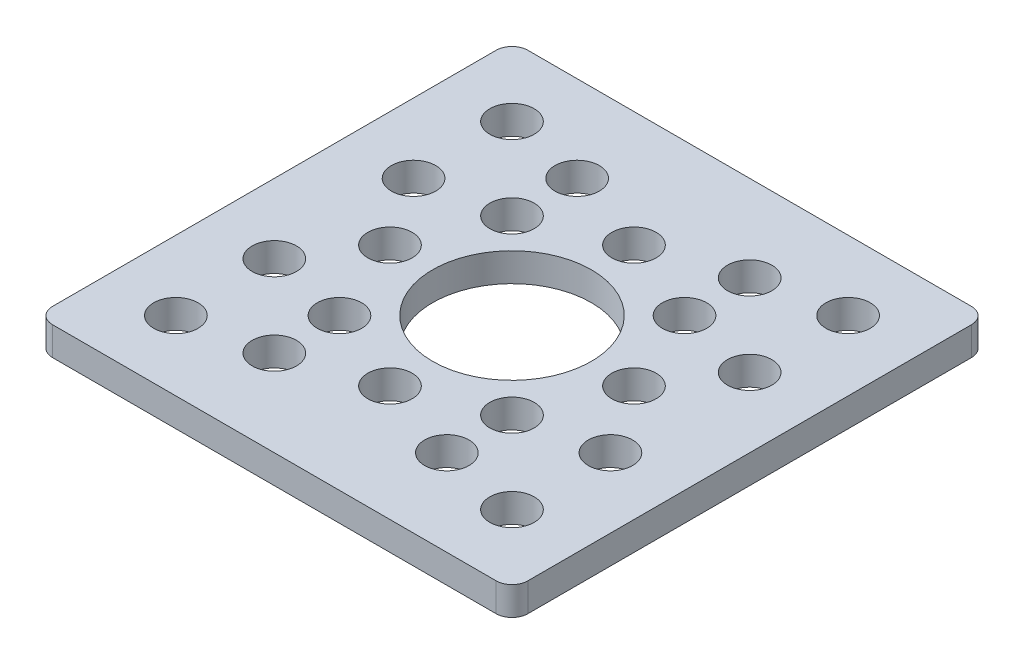
ISO-10303-21;
HEADER;
FILE_DESCRIPTION(('STEP AP214'),'2;1');
FILE_NAME('part.step','',(''),(''),'','','');
FILE_SCHEMA(('AUTOMOTIVE_DESIGN { 1 0 10303 214 1 1 1 1 }'));
ENDSEC;
DATA;
#1=APPLICATION_CONTEXT('core data for automotive mechanical design processes');
#2=APPLICATION_PROTOCOL_DEFINITION('international standard','automotive_design',2000,#1);
#3=PRODUCT_CONTEXT('',#1,'mechanical');
#4=PRODUCT('Part','Part','',(#3));
#5=PRODUCT_RELATED_PRODUCT_CATEGORY('part','',(#4));
#6=PRODUCT_DEFINITION_FORMATION('','',#4);
#7=PRODUCT_DEFINITION_CONTEXT('part definition',#1,'design');
#8=PRODUCT_DEFINITION('design','',#6,#7);
#9=PRODUCT_DEFINITION_SHAPE('','',#8);
#10=(LENGTH_UNIT() NAMED_UNIT(*) SI_UNIT(.MILLI.,.METRE.));
#11=(NAMED_UNIT(*) PLANE_ANGLE_UNIT() SI_UNIT($,.RADIAN.));
#12=(NAMED_UNIT(*) SI_UNIT($,.STERADIAN.) SOLID_ANGLE_UNIT());
#13=UNCERTAINTY_MEASURE_WITH_UNIT(LENGTH_MEASURE(1.E-05),#10,'distance_accuracy_value','');
#14=(GEOMETRIC_REPRESENTATION_CONTEXT(3) GLOBAL_UNCERTAINTY_ASSIGNED_CONTEXT((#13)) GLOBAL_UNIT_ASSIGNED_CONTEXT((#10,
#11,#12)) REPRESENTATION_CONTEXT('',''));
#15=CARTESIAN_POINT('',(0.,0.,0.));
#16=DIRECTION('',(0.,0.,1.));
#17=DIRECTION('',(1.,0.,0.));
#18=AXIS2_PLACEMENT_3D('',#15,#16,#17);
#19=CARTESIAN_POINT('',(-17.78,2.286,-17.78));
#20=DIRECTION('',(0.,-1.,0.));
#21=DIRECTION('',(0.,0.,-1.));
#22=AXIS2_PLACEMENT_3D('',#19,#20,#21);
#23=CYLINDRICAL_SURFACE('',#22,1.27);
#24=CARTESIAN_POINT('',(-17.78,0.,-17.78));
#25=DIRECTION('',(0.,-1.,0.));
#26=DIRECTION('',(0.,0.,-1.));
#27=AXIS2_PLACEMENT_3D('',#24,#25,#26);
#28=CIRCLE('',#27,1.27);
#29=CARTESIAN_POINT('',(-19.05,0.,-17.78));
#30=VERTEX_POINT('',#29);
#31=CARTESIAN_POINT('',(-17.78,0.,-19.05));
#32=VERTEX_POINT('',#31);
#33=EDGE_CURVE('E132',#30,#32,#28,.T.);
#34=ORIENTED_EDGE('',*,*,#33,.F.);
#35=DIRECTION('',(0.,-1.,0.));
#36=VECTOR('',#35,1.);
#37=CARTESIAN_POINT('',(-19.05,2.286,-17.78));
#38=LINE('',#37,#36);
#39=CARTESIAN_POINT('',(-19.05,2.286,-17.78));
#40=VERTEX_POINT('',#39);
#41=EDGE_CURVE('E11',#40,#30,#38,.T.);
#42=ORIENTED_EDGE('',*,*,#41,.F.);
#43=CARTESIAN_POINT('',(-17.78,2.286,-17.78));
#44=DIRECTION('',(0.,-1.,0.));
#45=DIRECTION('',(0.,0.,-1.));
#46=AXIS2_PLACEMENT_3D('',#43,#44,#45);
#47=CIRCLE('',#46,1.27);
#48=CARTESIAN_POINT('',(-17.78,2.286,-19.05));
#49=VERTEX_POINT('',#48);
#50=EDGE_CURVE('E153',#40,#49,#47,.T.);
#51=ORIENTED_EDGE('',*,*,#50,.T.);
#52=DIRECTION('',(0.,-1.,0.));
#53=VECTOR('',#52,1.);
#54=CARTESIAN_POINT('',(-17.78,2.286,-19.05));
#55=LINE('',#54,#53);
#56=EDGE_CURVE('E38',#49,#32,#55,.T.);
#57=ORIENTED_EDGE('',*,*,#56,.T.);
#58=EDGE_LOOP('',(#34,#42,#51,#57));
#59=FACE_BOUND('',#58,.T.);
#60=ADVANCED_FACE('F35',(#59),#23,.T.);
#61=CARTESIAN_POINT('',(-19.05,2.286,17.78));
#62=DIRECTION('',(-1.,0.,0.));
#63=DIRECTION('',(0.,0.,1.));
#64=AXIS2_PLACEMENT_3D('',#61,#62,#63);
#65=PLANE('',#64);
#66=DIRECTION('',(0.,0.,-1.));
#67=VECTOR('',#66,1.);
#68=CARTESIAN_POINT('',(-19.05,0.,17.78));
#69=LINE('',#68,#67);
#70=CARTESIAN_POINT('',(-19.05,0.,17.78));
#71=VERTEX_POINT('',#70);
#72=EDGE_CURVE('E151',#71,#30,#69,.T.);
#73=ORIENTED_EDGE('',*,*,#72,.F.);
#74=DIRECTION('',(0.,-1.,0.));
#75=VECTOR('',#74,1.);
#76=CARTESIAN_POINT('',(-19.05,2.286,17.78));
#77=LINE('',#76,#75);
#78=CARTESIAN_POINT('',(-19.05,2.286,17.78));
#79=VERTEX_POINT('',#78);
#80=EDGE_CURVE('E44',#79,#71,#77,.T.);
#81=ORIENTED_EDGE('',*,*,#80,.F.);
#82=DIRECTION('',(0.,0.,-1.));
#83=VECTOR('',#82,1.);
#84=CARTESIAN_POINT('',(-19.05,2.286,17.78));
#85=LINE('',#84,#83);
#86=EDGE_CURVE('E122',#79,#40,#85,.T.);
#87=ORIENTED_EDGE('',*,*,#86,.T.);
#88=ORIENTED_EDGE('',*,*,#41,.T.);
#89=EDGE_LOOP('',(#73,#81,#87,#88));
#90=FACE_BOUND('',#89,.T.);
#91=ADVANCED_FACE('F165',(#90),#65,.T.);
#92=CARTESIAN_POINT('',(-17.78,2.286,17.78));
#93=DIRECTION('',(0.,-1.,0.));
#94=DIRECTION('',(0.,0.,-1.));
#95=AXIS2_PLACEMENT_3D('',#92,#93,#94);
#96=CYLINDRICAL_SURFACE('',#95,1.27);
#97=CARTESIAN_POINT('',(-17.78,0.,17.78));
#98=DIRECTION('',(0.,-1.,0.));
#99=DIRECTION('',(0.,0.,-1.));
#100=AXIS2_PLACEMENT_3D('',#97,#98,#99);
#101=CIRCLE('',#100,1.27);
#102=CARTESIAN_POINT('',(-17.78,0.,19.05));
#103=VERTEX_POINT('',#102);
#104=EDGE_CURVE('E109',#103,#71,#101,.T.);
#105=ORIENTED_EDGE('',*,*,#104,.F.);
#106=DIRECTION('',(0.,-1.,0.));
#107=VECTOR('',#106,1.);
#108=CARTESIAN_POINT('',(-17.78,2.286,19.05));
#109=LINE('',#108,#107);
#110=CARTESIAN_POINT('',(-17.78,2.286,19.05));
#111=VERTEX_POINT('',#110);
#112=EDGE_CURVE('E104',#111,#103,#109,.T.);
#113=ORIENTED_EDGE('',*,*,#112,.F.);
#114=CARTESIAN_POINT('',(-17.78,2.286,17.78));
#115=DIRECTION('',(0.,-1.,0.));
#116=DIRECTION('',(0.,0.,-1.));
#117=AXIS2_PLACEMENT_3D('',#114,#115,#116);
#118=CIRCLE('',#117,1.27);
#119=EDGE_CURVE('E107',#111,#79,#118,.T.);
#120=ORIENTED_EDGE('',*,*,#119,.T.);
#121=ORIENTED_EDGE('',*,*,#80,.T.);
#122=EDGE_LOOP('',(#105,#113,#120,#121));
#123=FACE_BOUND('',#122,.T.);
#124=ADVANCED_FACE('F106',(#123),#96,.T.);
#125=CARTESIAN_POINT('',(17.78,2.286,19.05));
#126=DIRECTION('',(0.,0.,1.));
#127=DIRECTION('',(1.,0.,0.));
#128=AXIS2_PLACEMENT_3D('',#125,#126,#127);
#129=PLANE('',#128);
#130=DIRECTION('',(-1.,0.,0.));
#131=VECTOR('',#130,1.);
#132=CARTESIAN_POINT('',(17.78,0.,19.05));
#133=LINE('',#132,#131);
#134=CARTESIAN_POINT('',(17.78,0.,19.05));
#135=VERTEX_POINT('',#134);
#136=EDGE_CURVE('E148',#135,#103,#133,.T.);
#137=ORIENTED_EDGE('',*,*,#136,.F.);
#138=DIRECTION('',(0.,-1.,0.));
#139=VECTOR('',#138,1.);
#140=CARTESIAN_POINT('',(17.78,2.286,19.05));
#141=LINE('',#140,#139);
#142=CARTESIAN_POINT('',(17.78,2.286,19.05));
#143=VERTEX_POINT('',#142);
#144=EDGE_CURVE('E114',#143,#135,#141,.T.);
#145=ORIENTED_EDGE('',*,*,#144,.F.);
#146=DIRECTION('',(-1.,0.,0.));
#147=VECTOR('',#146,1.);
#148=CARTESIAN_POINT('',(17.78,2.286,19.05));
#149=LINE('',#148,#147);
#150=EDGE_CURVE('E120',#143,#111,#149,.T.);
#151=ORIENTED_EDGE('',*,*,#150,.T.);
#152=ORIENTED_EDGE('',*,*,#112,.T.);
#153=EDGE_LOOP('',(#137,#145,#151,#152));
#154=FACE_BOUND('',#153,.T.);
#155=ADVANCED_FACE('F124',(#154),#129,.T.);
#156=CARTESIAN_POINT('',(17.78,2.286,17.78));
#157=DIRECTION('',(0.,-1.,0.));
#158=DIRECTION('',(0.,0.,-1.));
#159=AXIS2_PLACEMENT_3D('',#156,#157,#158);
#160=CYLINDRICAL_SURFACE('',#159,1.27);
#161=CARTESIAN_POINT('',(17.78,0.,17.78));
#162=DIRECTION('',(0.,-1.,0.));
#163=DIRECTION('',(0.,0.,-1.));
#164=AXIS2_PLACEMENT_3D('',#161,#162,#163);
#165=CIRCLE('',#164,1.27);
#166=CARTESIAN_POINT('',(19.05,0.,17.78));
#167=VERTEX_POINT('',#166);
#168=EDGE_CURVE('E145',#167,#135,#165,.T.);
#169=ORIENTED_EDGE('',*,*,#168,.F.);
#170=DIRECTION('',(0.,-1.,0.));
#171=VECTOR('',#170,1.);
#172=CARTESIAN_POINT('',(19.05,2.286,17.78));
#173=LINE('',#172,#171);
#174=CARTESIAN_POINT('',(19.05,2.286,17.78));
#175=VERTEX_POINT('',#174);
#176=EDGE_CURVE('E157',#175,#167,#173,.T.);
#177=ORIENTED_EDGE('',*,*,#176,.F.);
#178=CARTESIAN_POINT('',(17.78,2.286,17.78));
#179=DIRECTION('',(0.,-1.,0.));
#180=DIRECTION('',(0.,0.,-1.));
#181=AXIS2_PLACEMENT_3D('',#178,#179,#180);
#182=CIRCLE('',#181,1.27);
#183=EDGE_CURVE('E125',#175,#143,#182,.T.);
#184=ORIENTED_EDGE('',*,*,#183,.T.);
#185=ORIENTED_EDGE('',*,*,#144,.T.);
#186=EDGE_LOOP('',(#169,#177,#184,#185));
#187=FACE_BOUND('',#186,.T.);
#188=ADVANCED_FACE('F178',(#187),#160,.T.);
#189=CARTESIAN_POINT('',(19.05,2.286,-17.78));
#190=DIRECTION('',(1.,0.,0.));
#191=DIRECTION('',(0.,0.,-1.));
#192=AXIS2_PLACEMENT_3D('',#189,#190,#191);
#193=PLANE('',#192);
#194=DIRECTION('',(0.,0.,1.));
#195=VECTOR('',#194,1.);
#196=CARTESIAN_POINT('',(19.05,0.,-17.78));
#197=LINE('',#196,#195);
#198=CARTESIAN_POINT('',(19.05,0.,-17.78));
#199=VERTEX_POINT('',#198);
#200=EDGE_CURVE('E142',#199,#167,#197,.T.);
#201=ORIENTED_EDGE('',*,*,#200,.F.);
#202=DIRECTION('',(0.,-1.,0.));
#203=VECTOR('',#202,1.);
#204=CARTESIAN_POINT('',(19.05,2.286,-17.78));
#205=LINE('',#204,#203);
#206=CARTESIAN_POINT('',(19.05,2.286,-17.78));
#207=VERTEX_POINT('',#206);
#208=EDGE_CURVE('E159',#207,#199,#205,.T.);
#209=ORIENTED_EDGE('',*,*,#208,.F.);
#210=DIRECTION('',(0.,0.,1.));
#211=VECTOR('',#210,1.);
#212=CARTESIAN_POINT('',(19.05,2.286,-17.78));
#213=LINE('',#212,#211);
#214=EDGE_CURVE('E127',#207,#175,#213,.T.);
#215=ORIENTED_EDGE('',*,*,#214,.T.);
#216=ORIENTED_EDGE('',*,*,#176,.T.);
#217=EDGE_LOOP('',(#201,#209,#215,#216));
#218=FACE_BOUND('',#217,.T.);
#219=ADVANCED_FACE('F181',(#218),#193,.T.);
#220=CARTESIAN_POINT('',(17.78,2.286,-17.78));
#221=DIRECTION('',(0.,-1.,0.));
#222=DIRECTION('',(0.,0.,-1.));
#223=AXIS2_PLACEMENT_3D('',#220,#221,#222);
#224=CYLINDRICAL_SURFACE('',#223,1.27);
#225=CARTESIAN_POINT('',(17.78,0.,-17.78));
#226=DIRECTION('',(0.,-1.,0.));
#227=DIRECTION('',(0.,0.,-1.));
#228=AXIS2_PLACEMENT_3D('',#225,#226,#227);
#229=CIRCLE('',#228,1.27);
#230=CARTESIAN_POINT('',(17.78,0.,-19.05));
#231=VERTEX_POINT('',#230);
#232=EDGE_CURVE('E139',#231,#199,#229,.T.);
#233=ORIENTED_EDGE('',*,*,#232,.F.);
#234=DIRECTION('',(0.,-1.,0.));
#235=VECTOR('',#234,1.);
#236=CARTESIAN_POINT('',(17.78,2.286,-19.05));
#237=LINE('',#236,#235);
#238=CARTESIAN_POINT('',(17.78,2.286,-19.05));
#239=VERTEX_POINT('',#238);
#240=EDGE_CURVE('E160',#239,#231,#237,.T.);
#241=ORIENTED_EDGE('',*,*,#240,.F.);
#242=CARTESIAN_POINT('',(17.78,2.286,-17.78));
#243=DIRECTION('',(0.,-1.,0.));
#244=DIRECTION('',(0.,0.,-1.));
#245=AXIS2_PLACEMENT_3D('',#242,#243,#244);
#246=CIRCLE('',#245,1.27);
#247=EDGE_CURVE('E417',#239,#207,#246,.T.);
#248=ORIENTED_EDGE('',*,*,#247,.T.);
#249=ORIENTED_EDGE('',*,*,#208,.T.);
#250=EDGE_LOOP('',(#233,#241,#248,#249));
#251=FACE_BOUND('',#250,.T.);
#252=ADVANCED_FACE('F185',(#251),#224,.T.);
#253=CARTESIAN_POINT('',(-17.78,2.286,-19.05));
#254=DIRECTION('',(0.,0.,-1.));
#255=DIRECTION('',(-1.,0.,0.));
#256=AXIS2_PLACEMENT_3D('',#253,#254,#255);
#257=PLANE('',#256);
#258=DIRECTION('',(1.,0.,0.));
#259=VECTOR('',#258,1.);
#260=CARTESIAN_POINT('',(-17.78,0.,-19.05));
#261=LINE('',#260,#259);
#262=EDGE_CURVE('E135',#32,#231,#261,.T.);
#263=ORIENTED_EDGE('',*,*,#262,.F.);
#264=ORIENTED_EDGE('',*,*,#56,.F.);
#265=DIRECTION('',(1.,0.,0.));
#266=VECTOR('',#265,1.);
#267=CARTESIAN_POINT('',(-17.78,2.286,-19.05));
#268=LINE('',#267,#266);
#269=EDGE_CURVE('E415',#49,#239,#268,.T.);
#270=ORIENTED_EDGE('',*,*,#269,.T.);
#271=ORIENTED_EDGE('',*,*,#240,.T.);
#272=EDGE_LOOP('',(#263,#264,#270,#271));
#273=FACE_BOUND('',#272,.T.);
#274=ADVANCED_FACE('F162',(#273),#257,.T.);
#275=CARTESIAN_POINT('',(-17.78,2.286,-17.78));
#276=DIRECTION('',(0.,-1.,0.));
#277=DIRECTION('',(0.,0.,-1.));
#278=AXIS2_PLACEMENT_3D('',#275,#276,#277);
#279=PLANE('',#278);
#280=CARTESIAN_POINT('',(-6.91479721322325,2.286,12.1352027867768));
#281=DIRECTION('',(0.,-1.,0.));
#282=DIRECTION('',(0.,0.,1.));
#283=AXIS2_PLACEMENT_3D('',#280,#281,#282);
#284=CIRCLE('',#283,1.77799999999999);
#285=CARTESIAN_POINT('',(-6.91479721322325,2.286,13.9132027867767));
#286=VERTEX_POINT('',#285);
#287=EDGE_CURVE('E288',#286,#286,#284,.T.);
#288=ORIENTED_EDGE('',*,*,#287,.T.);
#289=EDGE_LOOP('',(#288));
#290=FACE_BOUND('',#289,.T.);
#291=CARTESIAN_POINT('',(-13.4703841816038,2.286,-13.4703841816037));
#292=DIRECTION('',(0.,-1.,0.));
#293=DIRECTION('',(0.,0.,1.));
#294=AXIS2_PLACEMENT_3D('',#291,#292,#293);
#295=CIRCLE('',#294,1.77799999999999);
#296=CARTESIAN_POINT('',(-13.4703841816038,2.286,-11.6923841816037));
#297=VERTEX_POINT('',#296);
#298=EDGE_CURVE('E296',#297,#297,#295,.T.);
#299=ORIENTED_EDGE('',*,*,#298,.T.);
#300=EDGE_LOOP('',(#299));
#301=FACE_BOUND('',#300,.T.);
#302=CARTESIAN_POINT('',(-13.4703841816037,2.286,-5.57961581839627));
#303=DIRECTION('',(0.,-1.,0.));
#304=DIRECTION('',(0.,0.,1.));
#305=AXIS2_PLACEMENT_3D('',#302,#303,#304);
#306=CIRCLE('',#305,1.77799999999999);
#307=CARTESIAN_POINT('',(-13.4703841816037,2.286,-3.80161581839628));
#308=VERTEX_POINT('',#307);
#309=EDGE_CURVE('E302',#308,#308,#306,.T.);
#310=ORIENTED_EDGE('',*,*,#309,.T.);
#311=EDGE_LOOP('',(#310));
#312=FACE_BOUND('',#311,.T.);
#313=CARTESIAN_POINT('',(6.91479721322325,2.286,-12.1352027867768));
#314=DIRECTION('',(0.,-1.,0.));
#315=DIRECTION('',(0.,0.,1.));
#316=AXIS2_PLACEMENT_3D('',#313,#314,#315);
#317=CIRCLE('',#316,1.77799999999999);
#318=CARTESIAN_POINT('',(6.91479721322325,2.286,-10.3572027867768));
#319=VERTEX_POINT('',#318);
#320=EDGE_CURVE('E308',#319,#319,#317,.T.);
#321=ORIENTED_EDGE('',*,*,#320,.T.);
#322=EDGE_LOOP('',(#321));
#323=FACE_BOUND('',#322,.T.);
#324=CARTESIAN_POINT('',(13.4703841816037,2.286,-5.57961581839627));
#325=DIRECTION('',(0.,-1.,0.));
#326=DIRECTION('',(0.,0.,1.));
#327=AXIS2_PLACEMENT_3D('',#324,#325,#326);
#328=CIRCLE('',#327,1.77799999999999);
#329=CARTESIAN_POINT('',(13.4703841816037,2.286,-3.80161581839628));
#330=VERTEX_POINT('',#329);
#331=EDGE_CURVE('E314',#330,#330,#328,.T.);
#332=ORIENTED_EDGE('',*,*,#331,.T.);
#333=EDGE_LOOP('',(#332));
#334=FACE_BOUND('',#333,.T.);
#335=CARTESIAN_POINT('',(13.4703841816038,2.286,13.4703841816037));
#336=DIRECTION('',(0.,-1.,0.));
#337=DIRECTION('',(0.,0.,1.));
#338=AXIS2_PLACEMENT_3D('',#335,#336,#337);
#339=CIRCLE('',#338,1.77799999999999);
#340=CARTESIAN_POINT('',(13.4703841816038,2.286,15.2483841816037));
#341=VERTEX_POINT('',#340);
#342=EDGE_CURVE('E320',#341,#341,#339,.T.);
#343=ORIENTED_EDGE('',*,*,#342,.T.);
#344=EDGE_LOOP('',(#343));
#345=FACE_BOUND('',#344,.T.);
#346=CARTESIAN_POINT('',(6.91479721322325,2.286,12.1352027867768));
#347=DIRECTION('',(0.,-1.,0.));
#348=DIRECTION('',(0.,0.,1.));
#349=AXIS2_PLACEMENT_3D('',#346,#347,#348);
#350=CIRCLE('',#349,1.77799999999999);
#351=CARTESIAN_POINT('',(6.91479721322325,2.286,13.9132027867767));
#352=VERTEX_POINT('',#351);
#353=EDGE_CURVE('E326',#352,#352,#350,.T.);
#354=ORIENTED_EDGE('',*,*,#353,.T.);
#355=EDGE_LOOP('',(#354));
#356=FACE_BOUND('',#355,.T.);
#357=CARTESIAN_POINT('',(13.4703841816037,2.286,5.57961581839627));
#358=DIRECTION('',(0.,-1.,0.));
#359=DIRECTION('',(0.,0.,1.));
#360=AXIS2_PLACEMENT_3D('',#357,#358,#359);
#361=CIRCLE('',#360,1.77799999999999);
#362=CARTESIAN_POINT('',(13.4703841816037,2.286,7.35761581839627));
#363=VERTEX_POINT('',#362);
#364=EDGE_CURVE('E332',#363,#363,#361,.T.);
#365=ORIENTED_EDGE('',*,*,#364,.T.);
#366=EDGE_LOOP('',(#365));
#367=FACE_BOUND('',#366,.T.);
#368=CARTESIAN_POINT('',(1.02429588037641E-13,2.286,9.779));
#369=DIRECTION('',(0.,-1.,0.));
#370=DIRECTION('',(0.,0.,1.));
#371=AXIS2_PLACEMENT_3D('',#368,#369,#370);
#372=CIRCLE('',#371,1.778);
#373=CARTESIAN_POINT('',(1.02429588037641E-13,2.286,11.557));
#374=VERTEX_POINT('',#373);
#375=EDGE_CURVE('E338',#374,#374,#372,.T.);
#376=ORIENTED_EDGE('',*,*,#375,.T.);
#377=EDGE_LOOP('',(#376));
#378=FACE_BOUND('',#377,.T.);
#379=CARTESIAN_POINT('',(-6.91479721322319,2.286,6.91479721322331));
#380=DIRECTION('',(0.,-1.,0.));
#381=DIRECTION('',(0.,0.,1.));
#382=AXIS2_PLACEMENT_3D('',#379,#380,#381);
#383=CIRCLE('',#382,1.778);
#384=CARTESIAN_POINT('',(-6.91479721322319,2.286,8.69279721322331));
#385=VERTEX_POINT('',#384);
#386=EDGE_CURVE('E344',#385,#385,#383,.T.);
#387=ORIENTED_EDGE('',*,*,#386,.T.);
#388=EDGE_LOOP('',(#387));
#389=FACE_BOUND('',#388,.T.);
#390=CARTESIAN_POINT('',(-9.779,2.286,0.));
#391=DIRECTION('',(0.,-1.,0.));
#392=DIRECTION('',(0.,0.,1.));
#393=AXIS2_PLACEMENT_3D('',#390,#391,#392);
#394=CIRCLE('',#393,1.778);
#395=CARTESIAN_POINT('',(-9.779,2.286,1.778));
#396=VERTEX_POINT('',#395);
#397=EDGE_CURVE('E350',#396,#396,#394,.T.);
#398=ORIENTED_EDGE('',*,*,#397,.T.);
#399=EDGE_LOOP('',(#398));
#400=FACE_BOUND('',#399,.T.);
#401=CARTESIAN_POINT('',(-6.91479721322328,2.286,-6.91479721322321));
#402=DIRECTION('',(0.,-1.,0.));
#403=DIRECTION('',(0.,0.,1.));
#404=AXIS2_PLACEMENT_3D('',#401,#402,#403);
#405=CIRCLE('',#404,1.778);
#406=CARTESIAN_POINT('',(-6.91479721322328,2.286,-5.13679721322321));
#407=VERTEX_POINT('',#406);
#408=EDGE_CURVE('E356',#407,#407,#405,.T.);
#409=ORIENTED_EDGE('',*,*,#408,.T.);
#410=EDGE_LOOP('',(#409));
#411=FACE_BOUND('',#410,.T.);
#412=CARTESIAN_POINT('',(0.,2.286,-9.779));
#413=DIRECTION('',(0.,-1.,0.));
#414=DIRECTION('',(0.,0.,1.));
#415=AXIS2_PLACEMENT_3D('',#412,#413,#414);
#416=CIRCLE('',#415,1.778);
#417=CARTESIAN_POINT('',(0.,2.286,-8.001));
#418=VERTEX_POINT('',#417);
#419=EDGE_CURVE('E362',#418,#418,#416,.T.);
#420=ORIENTED_EDGE('',*,*,#419,.T.);
#421=EDGE_LOOP('',(#420));
#422=FACE_BOUND('',#421,.T.);
#423=CARTESIAN_POINT('',(6.91479721322324,2.286,-6.91479721322326));
#424=DIRECTION('',(0.,-1.,0.));
#425=DIRECTION('',(0.,0.,1.));
#426=AXIS2_PLACEMENT_3D('',#423,#424,#425);
#427=CIRCLE('',#426,1.778);
#428=CARTESIAN_POINT('',(6.91479721322324,2.286,-5.13679721322326));
#429=VERTEX_POINT('',#428);
#430=EDGE_CURVE('E368',#429,#429,#427,.T.);
#431=ORIENTED_EDGE('',*,*,#430,.T.);
#432=EDGE_LOOP('',(#431));
#433=FACE_BOUND('',#432,.T.);
#434=CARTESIAN_POINT('',(9.779,2.286,0.));
#435=DIRECTION('',(0.,-1.,0.));
#436=DIRECTION('',(0.,0.,1.));
#437=AXIS2_PLACEMENT_3D('',#434,#435,#436);
#438=CIRCLE('',#437,1.778);
#439=CARTESIAN_POINT('',(9.779,2.286,1.778));
#440=VERTEX_POINT('',#439);
#441=EDGE_CURVE('E374',#440,#440,#438,.T.);
#442=ORIENTED_EDGE('',*,*,#441,.T.);
#443=EDGE_LOOP('',(#442));
#444=FACE_BOUND('',#443,.T.);
#445=CARTESIAN_POINT('',(0.,2.286,0.));
#446=DIRECTION('',(0.,-1.,0.));
#447=DIRECTION('',(0.,0.,1.));
#448=AXIS2_PLACEMENT_3D('',#445,#446,#447);
#449=CIRCLE('',#448,6.3627);
#450=CARTESIAN_POINT('',(0.,2.286,6.3627));
#451=VERTEX_POINT('',#450);
#452=EDGE_CURVE('E380',#451,#451,#449,.T.);
#453=ORIENTED_EDGE('',*,*,#452,.T.);
#454=EDGE_LOOP('',(#453));
#455=FACE_BOUND('',#454,.T.);
#456=CARTESIAN_POINT('',(6.91479721322333,2.286,6.91479721322316));
#457=DIRECTION('',(0.,-1.,0.));
#458=DIRECTION('',(0.,0.,1.));
#459=AXIS2_PLACEMENT_3D('',#456,#457,#458);
#460=CIRCLE('',#459,1.778);
#461=CARTESIAN_POINT('',(6.91479721322333,2.286,8.69279721322316));
#462=VERTEX_POINT('',#461);
#463=EDGE_CURVE('E386',#462,#462,#460,.T.);
#464=ORIENTED_EDGE('',*,*,#463,.T.);
#465=EDGE_LOOP('',(#464));
#466=FACE_BOUND('',#465,.T.);
#467=CARTESIAN_POINT('',(13.4703841816038,2.286,-13.4703841816037));
#468=DIRECTION('',(0.,-1.,0.));
#469=DIRECTION('',(0.,0.,1.));
#470=AXIS2_PLACEMENT_3D('',#467,#468,#469);
#471=CIRCLE('',#470,1.77799999999999);
#472=CARTESIAN_POINT('',(13.4703841816038,2.286,-11.6923841816037));
#473=VERTEX_POINT('',#472);
#474=EDGE_CURVE('E392',#473,#473,#471,.T.);
#475=ORIENTED_EDGE('',*,*,#474,.T.);
#476=EDGE_LOOP('',(#475));
#477=FACE_BOUND('',#476,.T.);
#478=CARTESIAN_POINT('',(-6.91479721322325,2.286,-12.1352027867768));
#479=DIRECTION('',(0.,-1.,0.));
#480=DIRECTION('',(0.,0.,1.));
#481=AXIS2_PLACEMENT_3D('',#478,#479,#480);
#482=CIRCLE('',#481,1.77799999999999);
#483=CARTESIAN_POINT('',(-6.91479721322325,2.286,-10.3572027867768));
#484=VERTEX_POINT('',#483);
#485=EDGE_CURVE('E398',#484,#484,#482,.T.);
#486=ORIENTED_EDGE('',*,*,#485,.T.);
#487=EDGE_LOOP('',(#486));
#488=FACE_BOUND('',#487,.T.);
#489=CARTESIAN_POINT('',(-13.4703841816037,2.286,5.57961581839627));
#490=DIRECTION('',(0.,-1.,0.));
#491=DIRECTION('',(0.,0.,1.));
#492=AXIS2_PLACEMENT_3D('',#489,#490,#491);
#493=CIRCLE('',#492,1.77799999999999);
#494=CARTESIAN_POINT('',(-13.4703841816037,2.286,7.35761581839627));
#495=VERTEX_POINT('',#494);
#496=EDGE_CURVE('E404',#495,#495,#493,.T.);
#497=ORIENTED_EDGE('',*,*,#496,.T.);
#498=EDGE_LOOP('',(#497));
#499=FACE_BOUND('',#498,.T.);
#500=CARTESIAN_POINT('',(-13.4703841816038,2.286,13.4703841816037));
#501=DIRECTION('',(0.,-1.,0.));
#502=DIRECTION('',(0.,0.,1.));
#503=AXIS2_PLACEMENT_3D('',#500,#501,#502);
#504=CIRCLE('',#503,1.77799999999999);
#505=CARTESIAN_POINT('',(-13.4703841816038,2.286,15.2483841816037));
#506=VERTEX_POINT('',#505);
#507=EDGE_CURVE('E136',#506,#506,#504,.T.);
#508=ORIENTED_EDGE('',*,*,#507,.T.);
#509=EDGE_LOOP('',(#508));
#510=FACE_BOUND('',#509,.T.);
#511=ORIENTED_EDGE('',*,*,#50,.F.);
#512=ORIENTED_EDGE('',*,*,#86,.F.);
#513=ORIENTED_EDGE('',*,*,#119,.F.);
#514=ORIENTED_EDGE('',*,*,#150,.F.);
#515=ORIENTED_EDGE('',*,*,#183,.F.);
#516=ORIENTED_EDGE('',*,*,#214,.F.);
#517=ORIENTED_EDGE('',*,*,#247,.F.);
#518=ORIENTED_EDGE('',*,*,#269,.F.);
#519=EDGE_LOOP('',(#511,#512,#513,#514,#515,#516,#517,#518));
#520=FACE_BOUND('',#519,.T.);
#521=ADVANCED_FACE('F118',(#290,#301,#312,#323,#334,#345,#356,#367,#378,#389,#400,#411,#422,
#433,#444,#455,#466,#477,#488,#499,#510,#520),#279,.F.);
#522=CARTESIAN_POINT('',(-17.78,0.,-17.78));
#523=DIRECTION('',(0.,-1.,0.));
#524=DIRECTION('',(0.,0.,-1.));
#525=AXIS2_PLACEMENT_3D('',#522,#523,#524);
#526=PLANE('',#525);
#527=CARTESIAN_POINT('',(-6.91479721322325,0.,12.1352027867768));
#528=DIRECTION('',(0.,-1.,0.));
#529=DIRECTION('',(0.,0.,1.));
#530=AXIS2_PLACEMENT_3D('',#527,#528,#529);
#531=CIRCLE('',#530,1.77799999999999);
#532=CARTESIAN_POINT('',(-6.91479721322325,0.,13.9132027867767));
#533=VERTEX_POINT('',#532);
#534=EDGE_CURVE('E291',#533,#533,#531,.T.);
#535=ORIENTED_EDGE('',*,*,#534,.F.);
#536=EDGE_LOOP('',(#535));
#537=FACE_BOUND('',#536,.T.);
#538=CARTESIAN_POINT('',(-13.4703841816038,0.,-13.4703841816037));
#539=DIRECTION('',(0.,-1.,0.));
#540=DIRECTION('',(0.,0.,1.));
#541=AXIS2_PLACEMENT_3D('',#538,#539,#540);
#542=CIRCLE('',#541,1.77799999999999);
#543=CARTESIAN_POINT('',(-13.4703841816038,0.,-11.6923841816037));
#544=VERTEX_POINT('',#543);
#545=EDGE_CURVE('E293',#544,#544,#542,.T.);
#546=ORIENTED_EDGE('',*,*,#545,.F.);
#547=EDGE_LOOP('',(#546));
#548=FACE_BOUND('',#547,.T.);
#549=CARTESIAN_POINT('',(-13.4703841816037,0.,-5.57961581839627));
#550=DIRECTION('',(0.,-1.,0.));
#551=DIRECTION('',(0.,0.,1.));
#552=AXIS2_PLACEMENT_3D('',#549,#550,#551);
#553=CIRCLE('',#552,1.77799999999999);
#554=CARTESIAN_POINT('',(-13.4703841816037,0.,-3.80161581839628));
#555=VERTEX_POINT('',#554);
#556=EDGE_CURVE('E299',#555,#555,#553,.T.);
#557=ORIENTED_EDGE('',*,*,#556,.F.);
#558=EDGE_LOOP('',(#557));
#559=FACE_BOUND('',#558,.T.);
#560=CARTESIAN_POINT('',(6.91479721322325,0.,-12.1352027867768));
#561=DIRECTION('',(0.,-1.,0.));
#562=DIRECTION('',(0.,0.,1.));
#563=AXIS2_PLACEMENT_3D('',#560,#561,#562);
#564=CIRCLE('',#563,1.77799999999999);
#565=CARTESIAN_POINT('',(6.91479721322325,0.,-10.3572027867768));
#566=VERTEX_POINT('',#565);
#567=EDGE_CURVE('E305',#566,#566,#564,.T.);
#568=ORIENTED_EDGE('',*,*,#567,.F.);
#569=EDGE_LOOP('',(#568));
#570=FACE_BOUND('',#569,.T.);
#571=CARTESIAN_POINT('',(13.4703841816037,0.,-5.57961581839627));
#572=DIRECTION('',(0.,-1.,0.));
#573=DIRECTION('',(0.,0.,1.));
#574=AXIS2_PLACEMENT_3D('',#571,#572,#573);
#575=CIRCLE('',#574,1.77799999999999);
#576=CARTESIAN_POINT('',(13.4703841816037,0.,-3.80161581839628));
#577=VERTEX_POINT('',#576);
#578=EDGE_CURVE('E311',#577,#577,#575,.T.);
#579=ORIENTED_EDGE('',*,*,#578,.F.);
#580=EDGE_LOOP('',(#579));
#581=FACE_BOUND('',#580,.T.);
#582=CARTESIAN_POINT('',(13.4703841816038,0.,13.4703841816037));
#583=DIRECTION('',(0.,-1.,0.));
#584=DIRECTION('',(0.,0.,1.));
#585=AXIS2_PLACEMENT_3D('',#582,#583,#584);
#586=CIRCLE('',#585,1.77799999999999);
#587=CARTESIAN_POINT('',(13.4703841816038,0.,15.2483841816037));
#588=VERTEX_POINT('',#587);
#589=EDGE_CURVE('E317',#588,#588,#586,.T.);
#590=ORIENTED_EDGE('',*,*,#589,.F.);
#591=EDGE_LOOP('',(#590));
#592=FACE_BOUND('',#591,.T.);
#593=CARTESIAN_POINT('',(6.91479721322325,0.,12.1352027867768));
#594=DIRECTION('',(0.,-1.,0.));
#595=DIRECTION('',(0.,0.,1.));
#596=AXIS2_PLACEMENT_3D('',#593,#594,#595);
#597=CIRCLE('',#596,1.77799999999999);
#598=CARTESIAN_POINT('',(6.91479721322325,0.,13.9132027867767));
#599=VERTEX_POINT('',#598);
#600=EDGE_CURVE('E323',#599,#599,#597,.T.);
#601=ORIENTED_EDGE('',*,*,#600,.F.);
#602=EDGE_LOOP('',(#601));
#603=FACE_BOUND('',#602,.T.);
#604=CARTESIAN_POINT('',(13.4703841816037,0.,5.57961581839627));
#605=DIRECTION('',(0.,-1.,0.));
#606=DIRECTION('',(0.,0.,1.));
#607=AXIS2_PLACEMENT_3D('',#604,#605,#606);
#608=CIRCLE('',#607,1.77799999999999);
#609=CARTESIAN_POINT('',(13.4703841816037,0.,7.35761581839627));
#610=VERTEX_POINT('',#609);
#611=EDGE_CURVE('E329',#610,#610,#608,.T.);
#612=ORIENTED_EDGE('',*,*,#611,.F.);
#613=EDGE_LOOP('',(#612));
#614=FACE_BOUND('',#613,.T.);
#615=CARTESIAN_POINT('',(1.02429588037641E-13,0.,9.779));
#616=DIRECTION('',(0.,-1.,0.));
#617=DIRECTION('',(0.,0.,1.));
#618=AXIS2_PLACEMENT_3D('',#615,#616,#617);
#619=CIRCLE('',#618,1.778);
#620=CARTESIAN_POINT('',(1.02429588037641E-13,0.,11.557));
#621=VERTEX_POINT('',#620);
#622=EDGE_CURVE('E335',#621,#621,#619,.T.);
#623=ORIENTED_EDGE('',*,*,#622,.F.);
#624=EDGE_LOOP('',(#623));
#625=FACE_BOUND('',#624,.T.);
#626=CARTESIAN_POINT('',(-6.91479721322319,0.,6.91479721322331));
#627=DIRECTION('',(0.,-1.,0.));
#628=DIRECTION('',(0.,0.,1.));
#629=AXIS2_PLACEMENT_3D('',#626,#627,#628);
#630=CIRCLE('',#629,1.778);
#631=CARTESIAN_POINT('',(-6.91479721322319,0.,8.69279721322331));
#632=VERTEX_POINT('',#631);
#633=EDGE_CURVE('E341',#632,#632,#630,.T.);
#634=ORIENTED_EDGE('',*,*,#633,.F.);
#635=EDGE_LOOP('',(#634));
#636=FACE_BOUND('',#635,.T.);
#637=CARTESIAN_POINT('',(-9.779,0.,0.));
#638=DIRECTION('',(0.,-1.,0.));
#639=DIRECTION('',(0.,0.,1.));
#640=AXIS2_PLACEMENT_3D('',#637,#638,#639);
#641=CIRCLE('',#640,1.778);
#642=CARTESIAN_POINT('',(-9.779,0.,1.778));
#643=VERTEX_POINT('',#642);
#644=EDGE_CURVE('E347',#643,#643,#641,.T.);
#645=ORIENTED_EDGE('',*,*,#644,.F.);
#646=EDGE_LOOP('',(#645));
#647=FACE_BOUND('',#646,.T.);
#648=CARTESIAN_POINT('',(-6.91479721322328,0.,-6.91479721322321));
#649=DIRECTION('',(0.,-1.,0.));
#650=DIRECTION('',(0.,0.,1.));
#651=AXIS2_PLACEMENT_3D('',#648,#649,#650);
#652=CIRCLE('',#651,1.778);
#653=CARTESIAN_POINT('',(-6.91479721322328,0.,-5.13679721322321));
#654=VERTEX_POINT('',#653);
#655=EDGE_CURVE('E353',#654,#654,#652,.T.);
#656=ORIENTED_EDGE('',*,*,#655,.F.);
#657=EDGE_LOOP('',(#656));
#658=FACE_BOUND('',#657,.T.);
#659=CARTESIAN_POINT('',(0.,0.,-9.779));
#660=DIRECTION('',(0.,-1.,0.));
#661=DIRECTION('',(0.,0.,1.));
#662=AXIS2_PLACEMENT_3D('',#659,#660,#661);
#663=CIRCLE('',#662,1.778);
#664=CARTESIAN_POINT('',(0.,0.,-8.001));
#665=VERTEX_POINT('',#664);
#666=EDGE_CURVE('E359',#665,#665,#663,.T.);
#667=ORIENTED_EDGE('',*,*,#666,.F.);
#668=EDGE_LOOP('',(#667));
#669=FACE_BOUND('',#668,.T.);
#670=CARTESIAN_POINT('',(6.91479721322324,0.,-6.91479721322326));
#671=DIRECTION('',(0.,-1.,0.));
#672=DIRECTION('',(0.,0.,1.));
#673=AXIS2_PLACEMENT_3D('',#670,#671,#672);
#674=CIRCLE('',#673,1.778);
#675=CARTESIAN_POINT('',(6.91479721322324,0.,-5.13679721322326));
#676=VERTEX_POINT('',#675);
#677=EDGE_CURVE('E365',#676,#676,#674,.T.);
#678=ORIENTED_EDGE('',*,*,#677,.F.);
#679=EDGE_LOOP('',(#678));
#680=FACE_BOUND('',#679,.T.);
#681=CARTESIAN_POINT('',(9.779,0.,0.));
#682=DIRECTION('',(0.,-1.,0.));
#683=DIRECTION('',(0.,0.,1.));
#684=AXIS2_PLACEMENT_3D('',#681,#682,#683);
#685=CIRCLE('',#684,1.778);
#686=CARTESIAN_POINT('',(9.779,0.,1.778));
#687=VERTEX_POINT('',#686);
#688=EDGE_CURVE('E371',#687,#687,#685,.T.);
#689=ORIENTED_EDGE('',*,*,#688,.F.);
#690=EDGE_LOOP('',(#689));
#691=FACE_BOUND('',#690,.T.);
#692=CARTESIAN_POINT('',(0.,0.,0.));
#693=DIRECTION('',(0.,-1.,0.));
#694=DIRECTION('',(0.,0.,1.));
#695=AXIS2_PLACEMENT_3D('',#692,#693,#694);
#696=CIRCLE('',#695,6.3627);
#697=CARTESIAN_POINT('',(0.,0.,6.3627));
#698=VERTEX_POINT('',#697);
#699=EDGE_CURVE('E377',#698,#698,#696,.T.);
#700=ORIENTED_EDGE('',*,*,#699,.F.);
#701=EDGE_LOOP('',(#700));
#702=FACE_BOUND('',#701,.T.);
#703=CARTESIAN_POINT('',(6.91479721322333,0.,6.91479721322316));
#704=DIRECTION('',(0.,-1.,0.));
#705=DIRECTION('',(0.,0.,1.));
#706=AXIS2_PLACEMENT_3D('',#703,#704,#705);
#707=CIRCLE('',#706,1.778);
#708=CARTESIAN_POINT('',(6.91479721322333,0.,8.69279721322316));
#709=VERTEX_POINT('',#708);
#710=EDGE_CURVE('E383',#709,#709,#707,.T.);
#711=ORIENTED_EDGE('',*,*,#710,.F.);
#712=EDGE_LOOP('',(#711));
#713=FACE_BOUND('',#712,.T.);
#714=CARTESIAN_POINT('',(13.4703841816038,0.,-13.4703841816037));
#715=DIRECTION('',(0.,-1.,0.));
#716=DIRECTION('',(0.,0.,1.));
#717=AXIS2_PLACEMENT_3D('',#714,#715,#716);
#718=CIRCLE('',#717,1.77799999999999);
#719=CARTESIAN_POINT('',(13.4703841816038,0.,-11.6923841816037));
#720=VERTEX_POINT('',#719);
#721=EDGE_CURVE('E389',#720,#720,#718,.T.);
#722=ORIENTED_EDGE('',*,*,#721,.F.);
#723=EDGE_LOOP('',(#722));
#724=FACE_BOUND('',#723,.T.);
#725=CARTESIAN_POINT('',(-6.91479721322325,0.,-12.1352027867768));
#726=DIRECTION('',(0.,-1.,0.));
#727=DIRECTION('',(0.,0.,1.));
#728=AXIS2_PLACEMENT_3D('',#725,#726,#727);
#729=CIRCLE('',#728,1.77799999999999);
#730=CARTESIAN_POINT('',(-6.91479721322325,0.,-10.3572027867768));
#731=VERTEX_POINT('',#730);
#732=EDGE_CURVE('E395',#731,#731,#729,.T.);
#733=ORIENTED_EDGE('',*,*,#732,.F.);
#734=EDGE_LOOP('',(#733));
#735=FACE_BOUND('',#734,.T.);
#736=CARTESIAN_POINT('',(-13.4703841816037,0.,5.57961581839627));
#737=DIRECTION('',(0.,-1.,0.));
#738=DIRECTION('',(0.,0.,1.));
#739=AXIS2_PLACEMENT_3D('',#736,#737,#738);
#740=CIRCLE('',#739,1.77799999999999);
#741=CARTESIAN_POINT('',(-13.4703841816037,0.,7.35761581839627));
#742=VERTEX_POINT('',#741);
#743=EDGE_CURVE('E401',#742,#742,#740,.T.);
#744=ORIENTED_EDGE('',*,*,#743,.F.);
#745=EDGE_LOOP('',(#744));
#746=FACE_BOUND('',#745,.T.);
#747=CARTESIAN_POINT('',(-13.4703841816038,0.,13.4703841816037));
#748=DIRECTION('',(0.,-1.,0.));
#749=DIRECTION('',(0.,0.,1.));
#750=AXIS2_PLACEMENT_3D('',#747,#748,#749);
#751=CIRCLE('',#750,1.77799999999999);
#752=CARTESIAN_POINT('',(-13.4703841816038,0.,15.2483841816037));
#753=VERTEX_POINT('',#752);
#754=EDGE_CURVE('E407',#753,#753,#751,.T.);
#755=ORIENTED_EDGE('',*,*,#754,.F.);
#756=EDGE_LOOP('',(#755));
#757=FACE_BOUND('',#756,.T.);
#758=ORIENTED_EDGE('',*,*,#33,.T.);
#759=ORIENTED_EDGE('',*,*,#262,.T.);
#760=ORIENTED_EDGE('',*,*,#232,.T.);
#761=ORIENTED_EDGE('',*,*,#200,.T.);
#762=ORIENTED_EDGE('',*,*,#168,.T.);
#763=ORIENTED_EDGE('',*,*,#136,.T.);
#764=ORIENTED_EDGE('',*,*,#104,.T.);
#765=ORIENTED_EDGE('',*,*,#72,.T.);
#766=EDGE_LOOP('',(#758,#759,#760,#761,#762,#763,#764,#765));
#767=FACE_BOUND('',#766,.T.);
#768=ADVANCED_FACE('F164',(#537,#548,#559,#570,#581,#592,#603,#614,#625,#636,#647,#658,#669,
#680,#691,#702,#713,#724,#735,#746,#757,#767),#526,.T.);
#769=CARTESIAN_POINT('',(-13.4703841816038,2.286,13.4703841816037));
#770=DIRECTION('',(0.,-1.,0.));
#771=DIRECTION('',(0.,0.,-1.));
#772=AXIS2_PLACEMENT_3D('',#769,#770,#771);
#773=CYLINDRICAL_SURFACE('',#772,1.77799999999999);
#774=ORIENTED_EDGE('',*,*,#507,.F.);
#775=EDGE_LOOP('',(#774));
#776=FACE_BOUND('',#775,.T.);
#777=ORIENTED_EDGE('',*,*,#754,.T.);
#778=EDGE_LOOP('',(#777));
#779=FACE_BOUND('',#778,.T.);
#780=ADVANCED_FACE('F197',(#776,#779),#773,.F.);
#781=CARTESIAN_POINT('',(-13.4703841816037,2.286,5.57961581839627));
#782=DIRECTION('',(0.,-1.,0.));
#783=DIRECTION('',(0.,0.,-1.));
#784=AXIS2_PLACEMENT_3D('',#781,#782,#783);
#785=CYLINDRICAL_SURFACE('',#784,1.77799999999999);
#786=ORIENTED_EDGE('',*,*,#496,.F.);
#787=EDGE_LOOP('',(#786));
#788=FACE_BOUND('',#787,.T.);
#789=ORIENTED_EDGE('',*,*,#743,.T.);
#790=EDGE_LOOP('',(#789));
#791=FACE_BOUND('',#790,.T.);
#792=ADVANCED_FACE('F204',(#788,#791),#785,.F.);
#793=CARTESIAN_POINT('',(-6.91479721322325,2.286,-12.1352027867768));
#794=DIRECTION('',(0.,-1.,0.));
#795=DIRECTION('',(0.,0.,-1.));
#796=AXIS2_PLACEMENT_3D('',#793,#794,#795);
#797=CYLINDRICAL_SURFACE('',#796,1.77799999999999);
#798=ORIENTED_EDGE('',*,*,#485,.F.);
#799=EDGE_LOOP('',(#798));
#800=FACE_BOUND('',#799,.T.);
#801=ORIENTED_EDGE('',*,*,#732,.T.);
#802=EDGE_LOOP('',(#801));
#803=FACE_BOUND('',#802,.T.);
#804=ADVANCED_FACE('F208',(#800,#803),#797,.F.);
#805=CARTESIAN_POINT('',(13.4703841816038,2.286,-13.4703841816037));
#806=DIRECTION('',(0.,-1.,0.));
#807=DIRECTION('',(0.,0.,-1.));
#808=AXIS2_PLACEMENT_3D('',#805,#806,#807);
#809=CYLINDRICAL_SURFACE('',#808,1.77799999999999);
#810=ORIENTED_EDGE('',*,*,#474,.F.);
#811=EDGE_LOOP('',(#810));
#812=FACE_BOUND('',#811,.T.);
#813=ORIENTED_EDGE('',*,*,#721,.T.);
#814=EDGE_LOOP('',(#813));
#815=FACE_BOUND('',#814,.T.);
#816=ADVANCED_FACE('F212',(#812,#815),#809,.F.);
#817=CARTESIAN_POINT('',(6.91479721322333,2.286,6.91479721322316));
#818=DIRECTION('',(0.,-1.,0.));
#819=DIRECTION('',(0.,0.,-1.));
#820=AXIS2_PLACEMENT_3D('',#817,#818,#819);
#821=CYLINDRICAL_SURFACE('',#820,1.778);
#822=ORIENTED_EDGE('',*,*,#463,.F.);
#823=EDGE_LOOP('',(#822));
#824=FACE_BOUND('',#823,.T.);
#825=ORIENTED_EDGE('',*,*,#710,.T.);
#826=EDGE_LOOP('',(#825));
#827=FACE_BOUND('',#826,.T.);
#828=ADVANCED_FACE('F216',(#824,#827),#821,.F.);
#829=CARTESIAN_POINT('',(0.,2.286,0.));
#830=DIRECTION('',(0.,-1.,0.));
#831=DIRECTION('',(0.,0.,-1.));
#832=AXIS2_PLACEMENT_3D('',#829,#830,#831);
#833=CYLINDRICAL_SURFACE('',#832,6.3627);
#834=ORIENTED_EDGE('',*,*,#452,.F.);
#835=EDGE_LOOP('',(#834));
#836=FACE_BOUND('',#835,.T.);
#837=ORIENTED_EDGE('',*,*,#699,.T.);
#838=EDGE_LOOP('',(#837));
#839=FACE_BOUND('',#838,.T.);
#840=ADVANCED_FACE('F220',(#836,#839),#833,.F.);
#841=CARTESIAN_POINT('',(9.779,2.286,0.));
#842=DIRECTION('',(0.,-1.,0.));
#843=DIRECTION('',(0.,0.,-1.));
#844=AXIS2_PLACEMENT_3D('',#841,#842,#843);
#845=CYLINDRICAL_SURFACE('',#844,1.778);
#846=ORIENTED_EDGE('',*,*,#441,.F.);
#847=EDGE_LOOP('',(#846));
#848=FACE_BOUND('',#847,.T.);
#849=ORIENTED_EDGE('',*,*,#688,.T.);
#850=EDGE_LOOP('',(#849));
#851=FACE_BOUND('',#850,.T.);
#852=ADVANCED_FACE('F224',(#848,#851),#845,.F.);
#853=CARTESIAN_POINT('',(6.91479721322324,2.286,-6.91479721322326));
#854=DIRECTION('',(0.,-1.,0.));
#855=DIRECTION('',(0.,0.,-1.));
#856=AXIS2_PLACEMENT_3D('',#853,#854,#855);
#857=CYLINDRICAL_SURFACE('',#856,1.778);
#858=ORIENTED_EDGE('',*,*,#430,.F.);
#859=EDGE_LOOP('',(#858));
#860=FACE_BOUND('',#859,.T.);
#861=ORIENTED_EDGE('',*,*,#677,.T.);
#862=EDGE_LOOP('',(#861));
#863=FACE_BOUND('',#862,.T.);
#864=ADVANCED_FACE('F228',(#860,#863),#857,.F.);
#865=CARTESIAN_POINT('',(0.,2.286,-9.779));
#866=DIRECTION('',(0.,-1.,0.));
#867=DIRECTION('',(0.,0.,-1.));
#868=AXIS2_PLACEMENT_3D('',#865,#866,#867);
#869=CYLINDRICAL_SURFACE('',#868,1.778);
#870=ORIENTED_EDGE('',*,*,#419,.F.);
#871=EDGE_LOOP('',(#870));
#872=FACE_BOUND('',#871,.T.);
#873=ORIENTED_EDGE('',*,*,#666,.T.);
#874=EDGE_LOOP('',(#873));
#875=FACE_BOUND('',#874,.T.);
#876=ADVANCED_FACE('F232',(#872,#875),#869,.F.);
#877=CARTESIAN_POINT('',(-6.91479721322328,2.286,-6.91479721322321));
#878=DIRECTION('',(0.,-1.,0.));
#879=DIRECTION('',(0.,0.,-1.));
#880=AXIS2_PLACEMENT_3D('',#877,#878,#879);
#881=CYLINDRICAL_SURFACE('',#880,1.778);
#882=ORIENTED_EDGE('',*,*,#408,.F.);
#883=EDGE_LOOP('',(#882));
#884=FACE_BOUND('',#883,.T.);
#885=ORIENTED_EDGE('',*,*,#655,.T.);
#886=EDGE_LOOP('',(#885));
#887=FACE_BOUND('',#886,.T.);
#888=ADVANCED_FACE('F236',(#884,#887),#881,.F.);
#889=CARTESIAN_POINT('',(-9.779,2.286,0.));
#890=DIRECTION('',(0.,-1.,0.));
#891=DIRECTION('',(0.,0.,-1.));
#892=AXIS2_PLACEMENT_3D('',#889,#890,#891);
#893=CYLINDRICAL_SURFACE('',#892,1.778);
#894=ORIENTED_EDGE('',*,*,#397,.F.);
#895=EDGE_LOOP('',(#894));
#896=FACE_BOUND('',#895,.T.);
#897=ORIENTED_EDGE('',*,*,#644,.T.);
#898=EDGE_LOOP('',(#897));
#899=FACE_BOUND('',#898,.T.);
#900=ADVANCED_FACE('F240',(#896,#899),#893,.F.);
#901=CARTESIAN_POINT('',(-6.91479721322319,2.286,6.91479721322331));
#902=DIRECTION('',(0.,-1.,0.));
#903=DIRECTION('',(0.,0.,-1.));
#904=AXIS2_PLACEMENT_3D('',#901,#902,#903);
#905=CYLINDRICAL_SURFACE('',#904,1.778);
#906=ORIENTED_EDGE('',*,*,#386,.F.);
#907=EDGE_LOOP('',(#906));
#908=FACE_BOUND('',#907,.T.);
#909=ORIENTED_EDGE('',*,*,#633,.T.);
#910=EDGE_LOOP('',(#909));
#911=FACE_BOUND('',#910,.T.);
#912=ADVANCED_FACE('F244',(#908,#911),#905,.F.);
#913=CARTESIAN_POINT('',(1.02429588037641E-13,2.286,9.779));
#914=DIRECTION('',(0.,-1.,0.));
#915=DIRECTION('',(0.,0.,-1.));
#916=AXIS2_PLACEMENT_3D('',#913,#914,#915);
#917=CYLINDRICAL_SURFACE('',#916,1.778);
#918=ORIENTED_EDGE('',*,*,#375,.F.);
#919=EDGE_LOOP('',(#918));
#920=FACE_BOUND('',#919,.T.);
#921=ORIENTED_EDGE('',*,*,#622,.T.);
#922=EDGE_LOOP('',(#921));
#923=FACE_BOUND('',#922,.T.);
#924=ADVANCED_FACE('F248',(#920,#923),#917,.F.);
#925=CARTESIAN_POINT('',(13.4703841816037,2.286,5.57961581839627));
#926=DIRECTION('',(0.,-1.,0.));
#927=DIRECTION('',(0.,0.,-1.));
#928=AXIS2_PLACEMENT_3D('',#925,#926,#927);
#929=CYLINDRICAL_SURFACE('',#928,1.77799999999999);
#930=ORIENTED_EDGE('',*,*,#364,.F.);
#931=EDGE_LOOP('',(#930));
#932=FACE_BOUND('',#931,.T.);
#933=ORIENTED_EDGE('',*,*,#611,.T.);
#934=EDGE_LOOP('',(#933));
#935=FACE_BOUND('',#934,.T.);
#936=ADVANCED_FACE('F252',(#932,#935),#929,.F.);
#937=CARTESIAN_POINT('',(6.91479721322325,2.286,12.1352027867768));
#938=DIRECTION('',(0.,-1.,0.));
#939=DIRECTION('',(0.,0.,-1.));
#940=AXIS2_PLACEMENT_3D('',#937,#938,#939);
#941=CYLINDRICAL_SURFACE('',#940,1.77799999999999);
#942=ORIENTED_EDGE('',*,*,#353,.F.);
#943=EDGE_LOOP('',(#942));
#944=FACE_BOUND('',#943,.T.);
#945=ORIENTED_EDGE('',*,*,#600,.T.);
#946=EDGE_LOOP('',(#945));
#947=FACE_BOUND('',#946,.T.);
#948=ADVANCED_FACE('F256',(#944,#947),#941,.F.);
#949=CARTESIAN_POINT('',(13.4703841816038,2.286,13.4703841816037));
#950=DIRECTION('',(0.,-1.,0.));
#951=DIRECTION('',(0.,0.,-1.));
#952=AXIS2_PLACEMENT_3D('',#949,#950,#951);
#953=CYLINDRICAL_SURFACE('',#952,1.77799999999999);
#954=ORIENTED_EDGE('',*,*,#342,.F.);
#955=EDGE_LOOP('',(#954));
#956=FACE_BOUND('',#955,.T.);
#957=ORIENTED_EDGE('',*,*,#589,.T.);
#958=EDGE_LOOP('',(#957));
#959=FACE_BOUND('',#958,.T.);
#960=ADVANCED_FACE('F260',(#956,#959),#953,.F.);
#961=CARTESIAN_POINT('',(13.4703841816037,2.286,-5.57961581839627));
#962=DIRECTION('',(0.,-1.,0.));
#963=DIRECTION('',(0.,0.,-1.));
#964=AXIS2_PLACEMENT_3D('',#961,#962,#963);
#965=CYLINDRICAL_SURFACE('',#964,1.77799999999999);
#966=ORIENTED_EDGE('',*,*,#331,.F.);
#967=EDGE_LOOP('',(#966));
#968=FACE_BOUND('',#967,.T.);
#969=ORIENTED_EDGE('',*,*,#578,.T.);
#970=EDGE_LOOP('',(#969));
#971=FACE_BOUND('',#970,.T.);
#972=ADVANCED_FACE('F264',(#968,#971),#965,.F.);
#973=CARTESIAN_POINT('',(6.91479721322325,2.286,-12.1352027867768));
#974=DIRECTION('',(0.,-1.,0.));
#975=DIRECTION('',(0.,0.,-1.));
#976=AXIS2_PLACEMENT_3D('',#973,#974,#975);
#977=CYLINDRICAL_SURFACE('',#976,1.77799999999999);
#978=ORIENTED_EDGE('',*,*,#320,.F.);
#979=EDGE_LOOP('',(#978));
#980=FACE_BOUND('',#979,.T.);
#981=ORIENTED_EDGE('',*,*,#567,.T.);
#982=EDGE_LOOP('',(#981));
#983=FACE_BOUND('',#982,.T.);
#984=ADVANCED_FACE('F268',(#980,#983),#977,.F.);
#985=CARTESIAN_POINT('',(-13.4703841816037,2.286,-5.57961581839627));
#986=DIRECTION('',(0.,-1.,0.));
#987=DIRECTION('',(0.,0.,-1.));
#988=AXIS2_PLACEMENT_3D('',#985,#986,#987);
#989=CYLINDRICAL_SURFACE('',#988,1.77799999999999);
#990=ORIENTED_EDGE('',*,*,#309,.F.);
#991=EDGE_LOOP('',(#990));
#992=FACE_BOUND('',#991,.T.);
#993=ORIENTED_EDGE('',*,*,#556,.T.);
#994=EDGE_LOOP('',(#993));
#995=FACE_BOUND('',#994,.T.);
#996=ADVANCED_FACE('F272',(#992,#995),#989,.F.);
#997=CARTESIAN_POINT('',(-13.4703841816038,2.286,-13.4703841816037));
#998=DIRECTION('',(0.,-1.,0.));
#999=DIRECTION('',(0.,0.,-1.));
#1000=AXIS2_PLACEMENT_3D('',#997,#998,#999);
#1001=CYLINDRICAL_SURFACE('',#1000,1.77799999999999);
#1002=ORIENTED_EDGE('',*,*,#298,.F.);
#1003=EDGE_LOOP('',(#1002));
#1004=FACE_BOUND('',#1003,.T.);
#1005=ORIENTED_EDGE('',*,*,#545,.T.);
#1006=EDGE_LOOP('',(#1005));
#1007=FACE_BOUND('',#1006,.T.);
#1008=ADVANCED_FACE('F276',(#1004,#1007),#1001,.F.);
#1009=CARTESIAN_POINT('',(-6.91479721322325,2.286,12.1352027867768));
#1010=DIRECTION('',(0.,-1.,0.));
#1011=DIRECTION('',(0.,0.,-1.));
#1012=AXIS2_PLACEMENT_3D('',#1009,#1010,#1011);
#1013=CYLINDRICAL_SURFACE('',#1012,1.77799999999999);
#1014=ORIENTED_EDGE('',*,*,#287,.F.);
#1015=EDGE_LOOP('',(#1014));
#1016=FACE_BOUND('',#1015,.T.);
#1017=ORIENTED_EDGE('',*,*,#534,.T.);
#1018=EDGE_LOOP('',(#1017));
#1019=FACE_BOUND('',#1018,.T.);
#1020=ADVANCED_FACE('F280',(#1016,#1019),#1013,.F.);
#1021=CLOSED_SHELL('',(#60,#91,#124,#155,#188,#219,#252,#274,#521,#768,#780,#792,#804,#816,#828,
#840,#852,#864,#876,#888,#900,#912,#924,#936,#948,#960,#972,#984,#996,#1008,#1020));
#1022=MANIFOLD_SOLID_BREP('B2',#1021);
#1023=ADVANCED_BREP_SHAPE_REPRESENTATION('',(#18,#1022),#14);
#1024=SHAPE_DEFINITION_REPRESENTATION(#9,#1023);
ENDSEC;
END-ISO-10303-21;
